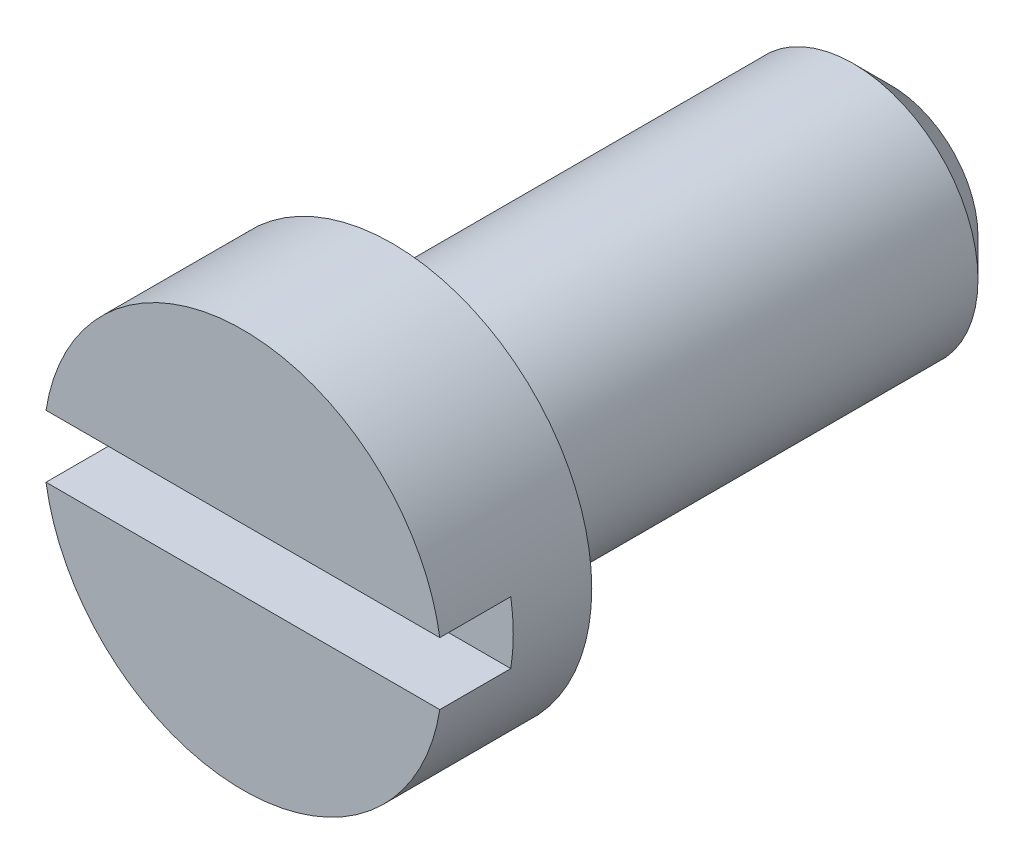
ISO-10303-21;
HEADER;
FILE_DESCRIPTION(('STEP AP214'),'2;1');
FILE_NAME('part.step','',(''),(''),'','','');
FILE_SCHEMA(('AUTOMOTIVE_DESIGN { 1 0 10303 214 1 1 1 1 }'));
ENDSEC;
DATA;
#1=APPLICATION_CONTEXT('core data for automotive mechanical design processes');
#2=APPLICATION_PROTOCOL_DEFINITION('international standard','automotive_design',2000,#1);
#3=PRODUCT_CONTEXT('',#1,'mechanical');
#4=PRODUCT('Part','Part','',(#3));
#5=PRODUCT_RELATED_PRODUCT_CATEGORY('part','',(#4));
#6=PRODUCT_DEFINITION_FORMATION('','',#4);
#7=PRODUCT_DEFINITION_CONTEXT('part definition',#1,'design');
#8=PRODUCT_DEFINITION('design','',#6,#7);
#9=PRODUCT_DEFINITION_SHAPE('','',#8);
#10=(LENGTH_UNIT() NAMED_UNIT(*) SI_UNIT(.MILLI.,.METRE.));
#11=(NAMED_UNIT(*) PLANE_ANGLE_UNIT() SI_UNIT($,.RADIAN.));
#12=(NAMED_UNIT(*) SI_UNIT($,.STERADIAN.) SOLID_ANGLE_UNIT());
#13=UNCERTAINTY_MEASURE_WITH_UNIT(LENGTH_MEASURE(1.E-05),#10,'distance_accuracy_value','');
#14=(GEOMETRIC_REPRESENTATION_CONTEXT(3) GLOBAL_UNCERTAINTY_ASSIGNED_CONTEXT((#13)) GLOBAL_UNIT_ASSIGNED_CONTEXT((#10,
#11,#12)) REPRESENTATION_CONTEXT('',''));
#15=CARTESIAN_POINT('',(0.,0.,0.));
#16=DIRECTION('',(0.,0.,1.));
#17=DIRECTION('',(1.,0.,0.));
#18=AXIS2_PLACEMENT_3D('',#15,#16,#17);
#19=CARTESIAN_POINT('',(0.,0.,6.));
#20=DIRECTION('',(0.,0.,1.));
#21=DIRECTION('',(1.,0.,0.));
#22=AXIS2_PLACEMENT_3D('',#19,#20,#21);
#23=PLANE('',#22);
#24=DIRECTION('',(-1.,0.,0.));
#25=VECTOR('',#24,1.);
#26=CARTESIAN_POINT('',(0.,1.25,6.));
#27=LINE('',#26,#25);
#28=CARTESIAN_POINT('',(7.90174031463955,1.25,6.));
#29=VERTEX_POINT('',#28);
#30=CARTESIAN_POINT('',(-7.90174031463955,1.25,6.));
#31=VERTEX_POINT('',#30);
#32=EDGE_CURVE('E77',#29,#31,#27,.T.);
#33=ORIENTED_EDGE('',*,*,#32,.F.);
#34=CARTESIAN_POINT('',(0.,0.,6.));
#35=DIRECTION('',(0.,0.,1.));
#36=DIRECTION('',(1.,0.,0.));
#37=AXIS2_PLACEMENT_3D('',#34,#35,#36);
#38=CIRCLE('',#37,8.);
#39=EDGE_CURVE('E90',#29,#31,#38,.T.);
#40=ORIENTED_EDGE('',*,*,#39,.T.);
#41=EDGE_LOOP('',(#33,#40));
#42=FACE_BOUND('',#41,.T.);
#43=ADVANCED_FACE('F29',(#42),#23,.T.);
#44=CARTESIAN_POINT('',(0.,0.,0.));
#45=DIRECTION('',(0.,0.,1.));
#46=DIRECTION('',(1.,0.,0.));
#47=AXIS2_PLACEMENT_3D('',#44,#45,#46);
#48=PLANE('',#47);
#49=CARTESIAN_POINT('',(0.,0.,0.));
#50=DIRECTION('',(0.,0.,1.));
#51=DIRECTION('',(1.,0.,0.));
#52=AXIS2_PLACEMENT_3D('',#49,#50,#51);
#53=CIRCLE('',#52,8.);
#54=CARTESIAN_POINT('',(8.,0.,0.));
#55=VERTEX_POINT('',#54);
#56=EDGE_CURVE('E91',#55,#55,#53,.T.);
#57=ORIENTED_EDGE('',*,*,#56,.F.);
#58=EDGE_LOOP('',(#57));
#59=FACE_BOUND('',#58,.T.);
#60=CARTESIAN_POINT('',(0.,0.,0.));
#61=DIRECTION('',(0.,0.,1.));
#62=DIRECTION('',(1.,0.,0.));
#63=AXIS2_PLACEMENT_3D('',#60,#61,#62);
#64=CIRCLE('',#63,5.);
#65=CARTESIAN_POINT('',(5.,0.,0.));
#66=VERTEX_POINT('',#65);
#67=EDGE_CURVE('E78',#66,#66,#64,.F.);
#68=ORIENTED_EDGE('',*,*,#67,.F.);
#69=EDGE_LOOP('',(#68));
#70=FACE_BOUND('',#69,.T.);
#71=ADVANCED_FACE('F118',(#59,#70),#48,.F.);
#72=CARTESIAN_POINT('',(0.,0.,6.));
#73=DIRECTION('',(0.,0.,-1.));
#74=DIRECTION('',(-1.,0.,0.));
#75=AXIS2_PLACEMENT_3D('',#72,#73,#74);
#76=CYLINDRICAL_SURFACE('',#75,8.);
#77=CARTESIAN_POINT('',(0.,0.,3.15));
#78=DIRECTION('',(0.,0.,1.));
#79=DIRECTION('',(1.,0.,0.));
#80=AXIS2_PLACEMENT_3D('',#77,#78,#79);
#81=CIRCLE('',#80,8.);
#82=CARTESIAN_POINT('',(-7.90174031463955,1.25,3.15));
#83=VERTEX_POINT('',#82);
#84=CARTESIAN_POINT('',(-7.90174031463955,-1.25,3.15));
#85=VERTEX_POINT('',#84);
#86=EDGE_CURVE('E102',#83,#85,#81,.T.);
#87=ORIENTED_EDGE('',*,*,#86,.F.);
#88=DIRECTION('',(0.,0.,-1.));
#89=VECTOR('',#88,1.);
#90=CARTESIAN_POINT('',(-7.90174031463955,1.25,6.));
#91=LINE('',#90,#89);
#92=EDGE_CURVE('E52',#83,#31,#91,.F.);
#93=ORIENTED_EDGE('',*,*,#92,.T.);
#94=ORIENTED_EDGE('',*,*,#39,.F.);
#95=DIRECTION('',(0.,0.,-1.));
#96=VECTOR('',#95,1.);
#97=CARTESIAN_POINT('',(7.90174031463955,1.25,6.));
#98=LINE('',#97,#96);
#99=CARTESIAN_POINT('',(7.90174031463955,1.25,3.15));
#100=VERTEX_POINT('',#99);
#101=EDGE_CURVE('E95',#29,#100,#98,.T.);
#102=ORIENTED_EDGE('',*,*,#101,.T.);
#103=CARTESIAN_POINT('',(7.90174031463955,-1.25,3.15));
#104=VERTEX_POINT('',#103);
#105=EDGE_CURVE('E86',#104,#100,#81,.T.);
#106=ORIENTED_EDGE('',*,*,#105,.F.);
#107=DIRECTION('',(0.,0.,-1.));
#108=VECTOR('',#107,1.);
#109=CARTESIAN_POINT('',(7.90174031463955,-1.25,6.));
#110=LINE('',#109,#108);
#111=CARTESIAN_POINT('',(7.90174031463955,-1.25,6.));
#112=VERTEX_POINT('',#111);
#113=EDGE_CURVE('E72',#104,#112,#110,.F.);
#114=ORIENTED_EDGE('',*,*,#113,.T.);
#115=CARTESIAN_POINT('',(-7.90174031463955,-1.25,6.));
#116=VERTEX_POINT('',#115);
#117=EDGE_CURVE('E84',#116,#112,#38,.T.);
#118=ORIENTED_EDGE('',*,*,#117,.F.);
#119=DIRECTION('',(0.,0.,-1.));
#120=VECTOR('',#119,1.);
#121=CARTESIAN_POINT('',(-7.90174031463955,-1.25,6.));
#122=LINE('',#121,#120);
#123=EDGE_CURVE('E44',#116,#85,#122,.T.);
#124=ORIENTED_EDGE('',*,*,#123,.T.);
#125=EDGE_LOOP('',(#87,#93,#94,#102,#106,#114,#118,#124));
#126=FACE_BOUND('',#125,.T.);
#127=ORIENTED_EDGE('',*,*,#56,.T.);
#128=EDGE_LOOP('',(#127));
#129=FACE_BOUND('',#128,.T.);
#130=ADVANCED_FACE('F31',(#126,#129),#76,.T.);
#131=DIRECTION('',(1.,0.,0.));
#132=VECTOR('',#131,1.);
#133=CARTESIAN_POINT('',(0.,-1.25,6.));
#134=LINE('',#133,#132);
#135=EDGE_CURVE('E69',#116,#112,#134,.T.);
#136=ORIENTED_EDGE('',*,*,#135,.F.);
#137=ORIENTED_EDGE('',*,*,#117,.T.);
#138=EDGE_LOOP('',(#136,#137));
#139=FACE_BOUND('',#138,.T.);
#140=ADVANCED_FACE('F89',(#139),#23,.T.);
#141=CARTESIAN_POINT('',(0.,0.,-20.));
#142=DIRECTION('',(0.,0.,1.));
#143=DIRECTION('',(1.,0.,0.));
#144=AXIS2_PLACEMENT_3D('',#141,#142,#143);
#145=CYLINDRICAL_SURFACE('',#144,5.);
#146=CARTESIAN_POINT('',(0.,0.,-18.5));
#147=DIRECTION('',(0.,0.,-1.));
#148=DIRECTION('',(-1.,0.,0.));
#149=AXIS2_PLACEMENT_3D('',#146,#147,#148);
#150=CIRCLE('',#149,5.);
#151=CARTESIAN_POINT('',(5.,0.,-18.5));
#152=VERTEX_POINT('',#151);
#153=EDGE_CURVE('E11',#152,#152,#150,.F.);
#154=ORIENTED_EDGE('',*,*,#153,.T.);
#155=EDGE_LOOP('',(#154));
#156=FACE_BOUND('',#155,.T.);
#157=ORIENTED_EDGE('',*,*,#67,.T.);
#158=EDGE_LOOP('',(#157));
#159=FACE_BOUND('',#158,.T.);
#160=ADVANCED_FACE('F126',(#156,#159),#145,.T.);
#161=CARTESIAN_POINT('',(0.,0.,-20.));
#162=DIRECTION('',(0.,0.,-1.));
#163=DIRECTION('',(-1.,0.,0.));
#164=AXIS2_PLACEMENT_3D('',#161,#162,#163);
#165=PLANE('',#164);
#166=CARTESIAN_POINT('',(0.,0.,-20.));
#167=DIRECTION('',(0.,0.,-1.));
#168=DIRECTION('',(-1.,0.,0.));
#169=AXIS2_PLACEMENT_3D('',#166,#167,#168);
#170=CIRCLE('',#169,3.5);
#171=CARTESIAN_POINT('',(3.5,0.,-20.));
#172=VERTEX_POINT('',#171);
#173=EDGE_CURVE('E37',#172,#172,#170,.T.);
#174=ORIENTED_EDGE('',*,*,#173,.T.);
#175=EDGE_LOOP('',(#174));
#176=FACE_BOUND('',#175,.T.);
#177=ADVANCED_FACE('F131',(#176),#165,.T.);
#178=CARTESIAN_POINT('',(-8.68222844693433,-1.25,3.15));
#179=DIRECTION('',(0.,0.,1.));
#180=DIRECTION('',(1.,0.,0.));
#181=AXIS2_PLACEMENT_3D('',#178,#179,#180);
#182=PLANE('',#181);
#183=ORIENTED_EDGE('',*,*,#86,.T.);
#184=DIRECTION('',(1.,0.,0.));
#185=VECTOR('',#184,1.);
#186=CARTESIAN_POINT('',(-8.68222844693433,-1.25,3.15));
#187=LINE('',#186,#185);
#188=EDGE_CURVE('E108',#85,#104,#187,.T.);
#189=ORIENTED_EDGE('',*,*,#188,.T.);
#190=ORIENTED_EDGE('',*,*,#105,.T.);
#191=DIRECTION('',(-1.,0.,0.));
#192=VECTOR('',#191,1.);
#193=CARTESIAN_POINT('',(-8.68222844693433,1.25,3.15));
#194=LINE('',#193,#192);
#195=EDGE_CURVE('E87',#100,#83,#194,.T.);
#196=ORIENTED_EDGE('',*,*,#195,.T.);
#197=EDGE_LOOP('',(#183,#189,#190,#196));
#198=FACE_BOUND('',#197,.T.);
#199=ADVANCED_FACE('F107',(#198),#182,.T.);
#200=CARTESIAN_POINT('',(-8.68222844693433,1.25,3.15));
#201=DIRECTION('',(0.,1.,0.));
#202=DIRECTION('',(0.,0.,1.));
#203=AXIS2_PLACEMENT_3D('',#200,#201,#202);
#204=PLANE('',#203);
#205=ORIENTED_EDGE('',*,*,#32,.T.);
#206=ORIENTED_EDGE('',*,*,#92,.F.);
#207=ORIENTED_EDGE('',*,*,#195,.F.);
#208=ORIENTED_EDGE('',*,*,#101,.F.);
#209=EDGE_LOOP('',(#205,#206,#207,#208));
#210=FACE_BOUND('',#209,.T.);
#211=ADVANCED_FACE('F115',(#210),#204,.F.);
#212=CARTESIAN_POINT('',(-8.68222844693433,-1.25,3.15));
#213=DIRECTION('',(0.,-1.,0.));
#214=DIRECTION('',(0.,0.,-1.));
#215=AXIS2_PLACEMENT_3D('',#212,#213,#214);
#216=PLANE('',#215);
#217=ORIENTED_EDGE('',*,*,#135,.T.);
#218=ORIENTED_EDGE('',*,*,#113,.F.);
#219=ORIENTED_EDGE('',*,*,#188,.F.);
#220=ORIENTED_EDGE('',*,*,#123,.F.);
#221=EDGE_LOOP('',(#217,#218,#219,#220));
#222=FACE_BOUND('',#221,.T.);
#223=ADVANCED_FACE('F71',(#222),#216,.F.);
#224=CARTESIAN_POINT('',(0.,0.,-20.));
#225=DIRECTION('',(0.,0.,1.));
#226=DIRECTION('',(1.,0.,0.));
#227=AXIS2_PLACEMENT_3D('',#224,#225,#226);
#228=CONICAL_SURFACE('',#227,3.5,0.785398163397445);
#229=CARTESIAN_POINT('',(5.,0.,-18.5));
#230=CARTESIAN_POINT('',(4.984375,0.,-18.515625));
#231=CARTESIAN_POINT('',(4.96875,0.,-18.53125));
#232=CARTESIAN_POINT('',(4.9375,0.,-18.5625));
#233=CARTESIAN_POINT('',(4.921875,0.,-18.578125));
#234=CARTESIAN_POINT('',(4.890625,0.,-18.609375));
#235=CARTESIAN_POINT('',(4.875,0.,-18.625));
#236=CARTESIAN_POINT('',(4.84375,0.,-18.65625));
#237=CARTESIAN_POINT('',(4.828125,0.,-18.671875));
#238=CARTESIAN_POINT('',(4.796875,0.,-18.703125));
#239=CARTESIAN_POINT('',(4.78125,0.,-18.71875));
#240=CARTESIAN_POINT('',(4.75,0.,-18.75));
#241=CARTESIAN_POINT('',(4.734375,0.,-18.765625));
#242=CARTESIAN_POINT('',(4.703125,0.,-18.796875));
#243=CARTESIAN_POINT('',(4.6875,0.,-18.8125));
#244=CARTESIAN_POINT('',(4.65625,0.,-18.84375));
#245=CARTESIAN_POINT('',(4.640625,0.,-18.859375));
#246=CARTESIAN_POINT('',(4.609375,0.,-18.890625));
#247=CARTESIAN_POINT('',(4.59375,0.,-18.90625));
#248=CARTESIAN_POINT('',(4.5625,0.,-18.9375));
#249=CARTESIAN_POINT('',(4.546875,0.,-18.953125));
#250=CARTESIAN_POINT('',(4.515625,0.,-18.984375));
#251=CARTESIAN_POINT('',(4.5,0.,-19.));
#252=CARTESIAN_POINT('',(4.46875,0.,-19.03125));
#253=CARTESIAN_POINT('',(4.453125,0.,-19.046875));
#254=CARTESIAN_POINT('',(4.421875,0.,-19.078125));
#255=CARTESIAN_POINT('',(4.40625,0.,-19.09375));
#256=CARTESIAN_POINT('',(4.375,0.,-19.125));
#257=CARTESIAN_POINT('',(4.359375,0.,-19.140625));
#258=CARTESIAN_POINT('',(4.328125,0.,-19.171875));
#259=CARTESIAN_POINT('',(4.3125,0.,-19.1875));
#260=CARTESIAN_POINT('',(4.28125,0.,-19.21875));
#261=CARTESIAN_POINT('',(4.265625,0.,-19.234375));
#262=CARTESIAN_POINT('',(4.234375,0.,-19.265625));
#263=CARTESIAN_POINT('',(4.21875,0.,-19.28125));
#264=CARTESIAN_POINT('',(4.1875,0.,-19.3125));
#265=CARTESIAN_POINT('',(4.171875,0.,-19.328125));
#266=CARTESIAN_POINT('',(4.140625,0.,-19.359375));
#267=CARTESIAN_POINT('',(4.125,0.,-19.375));
#268=CARTESIAN_POINT('',(4.09375,0.,-19.40625));
#269=CARTESIAN_POINT('',(4.078125,0.,-19.421875));
#270=CARTESIAN_POINT('',(4.046875,0.,-19.453125));
#271=CARTESIAN_POINT('',(4.03125,0.,-19.46875));
#272=CARTESIAN_POINT('',(4.,0.,-19.5));
#273=CARTESIAN_POINT('',(3.984375,0.,-19.515625));
#274=CARTESIAN_POINT('',(3.953125,0.,-19.546875));
#275=CARTESIAN_POINT('',(3.9375,0.,-19.5625));
#276=CARTESIAN_POINT('',(3.90625,0.,-19.59375));
#277=CARTESIAN_POINT('',(3.890625,0.,-19.609375));
#278=CARTESIAN_POINT('',(3.859375,0.,-19.640625));
#279=CARTESIAN_POINT('',(3.84375,0.,-19.65625));
#280=CARTESIAN_POINT('',(3.8125,0.,-19.6875));
#281=CARTESIAN_POINT('',(3.796875,0.,-19.703125));
#282=CARTESIAN_POINT('',(3.765625,0.,-19.734375));
#283=CARTESIAN_POINT('',(3.75,0.,-19.75));
#284=CARTESIAN_POINT('',(3.71875,0.,-19.78125));
#285=CARTESIAN_POINT('',(3.703125,0.,-19.796875));
#286=CARTESIAN_POINT('',(3.671875,0.,-19.828125));
#287=CARTESIAN_POINT('',(3.65625,0.,-19.84375));
#288=CARTESIAN_POINT('',(3.625,0.,-19.875));
#289=CARTESIAN_POINT('',(3.609375,0.,-19.890625));
#290=CARTESIAN_POINT('',(3.578125,0.,-19.921875));
#291=CARTESIAN_POINT('',(3.5625,0.,-19.9375));
#292=CARTESIAN_POINT('',(3.53125,0.,-19.96875));
#293=CARTESIAN_POINT('',(3.515625,0.,-19.984375));
#294=CARTESIAN_POINT('',(3.5,0.,-20.));
#295=B_SPLINE_CURVE_WITH_KNOTS('',3,(#229,#230,#231,#232,#233,#234,#235,#236,#237,#238,#239,
#240,#241,#242,#243,#244,#245,#246,#247,#248,#249,#250,#251,#252,#253,#254,#255,#256,#257,#258,
#259,#260,#261,#262,#263,#264,#265,#266,#267,#268,#269,#270,#271,#272,#273,#274,#275,#276,#277,
#278,#279,#280,#281,#282,#283,#284,#285,#286,#287,#288,#289,#290,#291,#292,#293,#294),
.UNSPECIFIED.,.F.,.F.,(4,2,2,2,2,2,2,2,2,2,2,2,2,2,2,2,2,2,2,2,2,2,2,2,2,2,2,2,2,2,2,2,4),(0.,
0.0662912607362407,0.13258252147248,0.198873782208718,0.265165042944958,0.331456303681196,
0.397747564417436,0.464038825153676,0.530330085889913,0.596621346626154,0.662912607362391,
0.729203868098631,0.795495128834872,0.861786389571109,0.928077650307349,0.994368911043587,
1.06066017177983,1.12695143251607,1.1932426932523,1.25953395398855,1.32582521472478,
1.39211647546102,1.45840773619726,1.5246989969335,1.59099025766974,1.65728151840598,
1.72357277914222,1.78986403987846,1.8561553006147,1.92244656135094,1.98873782208717,
2.05502908282341,2.12132034355965),.UNSPECIFIED.);
#296=EDGE_CURVE('BSEAM173',#152,#172,#295,.T.);
#297=ORIENTED_EDGE('',*,*,#153,.F.);
#298=ORIENTED_EDGE('',*,*,#173,.F.);
#299=ORIENTED_EDGE('',*,*,#296,.T.);
#300=ORIENTED_EDGE('',*,*,#296,.F.);
#301=EDGE_LOOP('',(#297,#299,#298,#300));
#302=FACE_BOUND('',#301,.T.);
#303=ADVANCED_FACE('F173',(#302),#228,.T.);
#304=CLOSED_SHELL('',(#43,#71,#130,#140,#160,#177,#199,#211,#223,#303));
#305=MANIFOLD_SOLID_BREP('B2',#304);
#306=ADVANCED_BREP_SHAPE_REPRESENTATION('',(#18,#305),#14);
#307=SHAPE_DEFINITION_REPRESENTATION(#9,#306);
ENDSEC;
END-ISO-10303-21;
